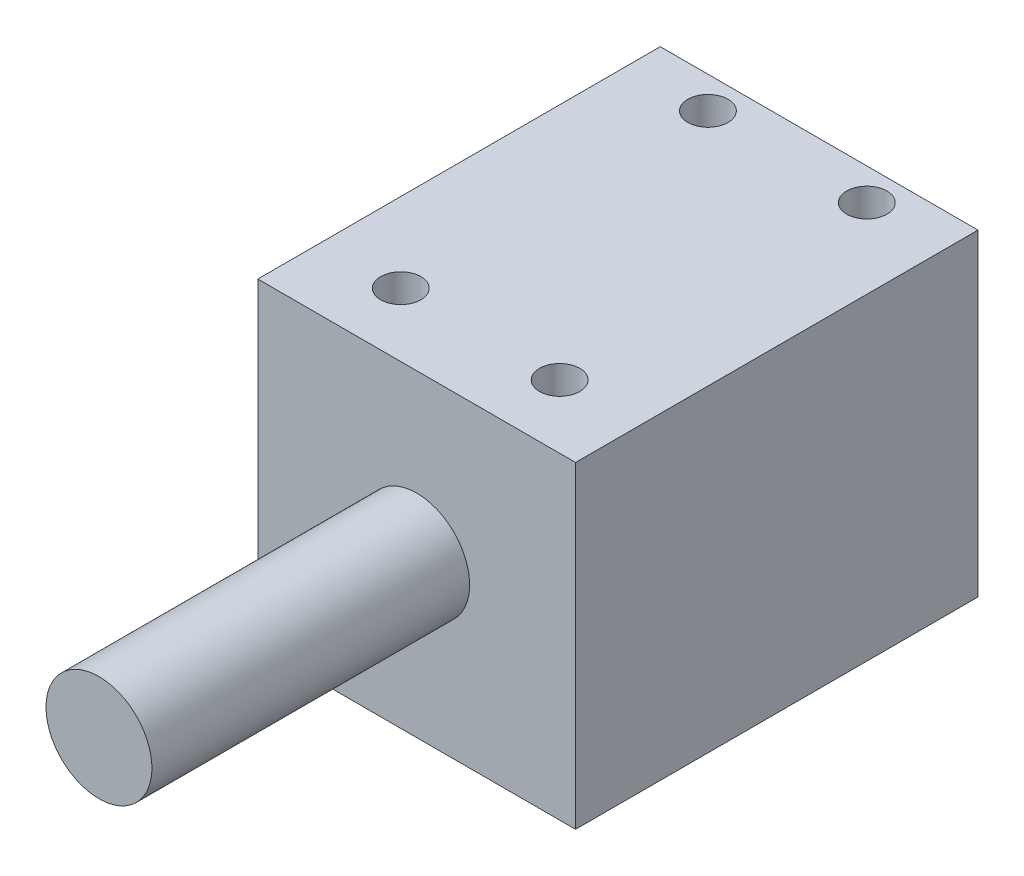
ISO-10303-21;
HEADER;
FILE_DESCRIPTION(('STEP AP214'),'2;1');
FILE_NAME('part.step','',(''),(''),'','','');
FILE_SCHEMA(('AUTOMOTIVE_DESIGN { 1 0 10303 214 1 1 1 1 }'));
ENDSEC;
DATA;
#1=APPLICATION_CONTEXT('core data for automotive mechanical design processes');
#2=APPLICATION_PROTOCOL_DEFINITION('international standard','automotive_design',2000,#1);
#3=PRODUCT_CONTEXT('',#1,'mechanical');
#4=PRODUCT('Part','Part','',(#3));
#5=PRODUCT_RELATED_PRODUCT_CATEGORY('part','',(#4));
#6=PRODUCT_DEFINITION_FORMATION('','',#4);
#7=PRODUCT_DEFINITION_CONTEXT('part definition',#1,'design');
#8=PRODUCT_DEFINITION('design','',#6,#7);
#9=PRODUCT_DEFINITION_SHAPE('','',#8);
#10=(LENGTH_UNIT() NAMED_UNIT(*) SI_UNIT(.MILLI.,.METRE.));
#11=(NAMED_UNIT(*) PLANE_ANGLE_UNIT() SI_UNIT($,.RADIAN.));
#12=(NAMED_UNIT(*) SI_UNIT($,.STERADIAN.) SOLID_ANGLE_UNIT());
#13=UNCERTAINTY_MEASURE_WITH_UNIT(LENGTH_MEASURE(1.E-05),#10,'distance_accuracy_value','');
#14=(GEOMETRIC_REPRESENTATION_CONTEXT(3) GLOBAL_UNCERTAINTY_ASSIGNED_CONTEXT((#13)) GLOBAL_UNIT_ASSIGNED_CONTEXT((#10,
#11,#12)) REPRESENTATION_CONTEXT('',''));
#15=CARTESIAN_POINT('',(0.,0.,0.));
#16=DIRECTION('',(0.,0.,1.));
#17=DIRECTION('',(1.,0.,0.));
#18=AXIS2_PLACEMENT_3D('',#15,#16,#17);
#19=CARTESIAN_POINT('',(-19.05,-19.05,-48.26));
#20=DIRECTION('',(1.,0.,0.));
#21=DIRECTION('',(0.,0.,-1.));
#22=AXIS2_PLACEMENT_3D('',#19,#20,#21);
#23=PLANE('',#22);
#24=DIRECTION('',(0.,1.,0.));
#25=VECTOR('',#24,1.);
#26=CARTESIAN_POINT('',(-19.05,-19.05,0.));
#27=LINE('',#26,#25);
#28=CARTESIAN_POINT('',(-19.05,-19.05,0.));
#29=VERTEX_POINT('',#28);
#30=CARTESIAN_POINT('',(-19.05,19.05,0.));
#31=VERTEX_POINT('',#30);
#32=EDGE_CURVE('E99',#29,#31,#27,.T.);
#33=ORIENTED_EDGE('',*,*,#32,.T.);
#34=DIRECTION('',(0.,0.,1.));
#35=VECTOR('',#34,1.);
#36=CARTESIAN_POINT('',(-19.05,19.05,-48.26));
#37=LINE('',#36,#35);
#38=CARTESIAN_POINT('',(-19.05,19.05,-48.26));
#39=VERTEX_POINT('',#38);
#40=EDGE_CURVE('E41',#39,#31,#37,.T.);
#41=ORIENTED_EDGE('',*,*,#40,.F.);
#42=DIRECTION('',(0.,1.,0.));
#43=VECTOR('',#42,1.);
#44=CARTESIAN_POINT('',(-19.05,-19.05,-48.26));
#45=LINE('',#44,#43);
#46=CARTESIAN_POINT('',(-19.05,-19.05,-48.26));
#47=VERTEX_POINT('',#46);
#48=EDGE_CURVE('E83',#47,#39,#45,.T.);
#49=ORIENTED_EDGE('',*,*,#48,.F.);
#50=DIRECTION('',(0.,0.,1.));
#51=VECTOR('',#50,1.);
#52=CARTESIAN_POINT('',(-19.05,-19.05,-48.26));
#53=LINE('',#52,#51);
#54=EDGE_CURVE('E49',#47,#29,#53,.T.);
#55=ORIENTED_EDGE('',*,*,#54,.T.);
#56=EDGE_LOOP('',(#33,#41,#49,#55));
#57=FACE_BOUND('',#56,.T.);
#58=ADVANCED_FACE('F33',(#57),#23,.F.);
#59=CARTESIAN_POINT('',(-19.05,19.05,-48.26));
#60=DIRECTION('',(0.,-1.,0.));
#61=DIRECTION('',(0.,0.,-1.));
#62=AXIS2_PLACEMENT_3D('',#59,#60,#61);
#63=PLANE('',#62);
#64=CARTESIAN_POINT('',(-9.525,19.05,-7.62));
#65=DIRECTION('',(0.,1.,0.));
#66=DIRECTION('',(0.,0.,1.));
#67=AXIS2_PLACEMENT_3D('',#64,#65,#66);
#68=CIRCLE('',#67,2.413);
#69=CARTESIAN_POINT('',(-9.525,19.05,-5.207));
#70=VERTEX_POINT('',#69);
#71=EDGE_CURVE('E133',#70,#70,#68,.T.);
#72=ORIENTED_EDGE('',*,*,#71,.F.);
#73=EDGE_LOOP('',(#72));
#74=FACE_BOUND('',#73,.T.);
#75=CARTESIAN_POINT('',(9.525,19.05,-7.62));
#76=DIRECTION('',(0.,1.,0.));
#77=DIRECTION('',(0.,0.,1.));
#78=AXIS2_PLACEMENT_3D('',#75,#76,#77);
#79=CIRCLE('',#78,2.413);
#80=CARTESIAN_POINT('',(9.525,19.05,-5.207));
#81=VERTEX_POINT('',#80);
#82=EDGE_CURVE('E137',#81,#81,#79,.T.);
#83=ORIENTED_EDGE('',*,*,#82,.F.);
#84=EDGE_LOOP('',(#83));
#85=FACE_BOUND('',#84,.T.);
#86=CARTESIAN_POINT('',(9.525,19.05,-44.45));
#87=DIRECTION('',(0.,1.,0.));
#88=DIRECTION('',(0.,0.,1.));
#89=AXIS2_PLACEMENT_3D('',#86,#87,#88);
#90=CIRCLE('',#89,2.413);
#91=CARTESIAN_POINT('',(9.525,19.05,-42.037));
#92=VERTEX_POINT('',#91);
#93=EDGE_CURVE('E141',#92,#92,#90,.T.);
#94=ORIENTED_EDGE('',*,*,#93,.F.);
#95=EDGE_LOOP('',(#94));
#96=FACE_BOUND('',#95,.T.);
#97=CARTESIAN_POINT('',(-9.525,19.05,-44.45));
#98=DIRECTION('',(0.,1.,0.));
#99=DIRECTION('',(0.,0.,1.));
#100=AXIS2_PLACEMENT_3D('',#97,#98,#99);
#101=CIRCLE('',#100,2.413);
#102=CARTESIAN_POINT('',(-9.525,19.05,-42.037));
#103=VERTEX_POINT('',#102);
#104=EDGE_CURVE('E144',#103,#103,#101,.T.);
#105=ORIENTED_EDGE('',*,*,#104,.F.);
#106=EDGE_LOOP('',(#105));
#107=FACE_BOUND('',#106,.T.);
#108=DIRECTION('',(1.,0.,0.));
#109=VECTOR('',#108,1.);
#110=CARTESIAN_POINT('',(-19.05,19.05,0.));
#111=LINE('',#110,#109);
#112=CARTESIAN_POINT('',(19.05,19.05,0.));
#113=VERTEX_POINT('',#112);
#114=EDGE_CURVE('E89',#31,#113,#111,.T.);
#115=ORIENTED_EDGE('',*,*,#114,.T.);
#116=DIRECTION('',(0.,0.,1.));
#117=VECTOR('',#116,1.);
#118=CARTESIAN_POINT('',(19.05,19.05,-48.26));
#119=LINE('',#118,#117);
#120=CARTESIAN_POINT('',(19.05,19.05,-48.26));
#121=VERTEX_POINT('',#120);
#122=EDGE_CURVE('E87',#121,#113,#119,.T.);
#123=ORIENTED_EDGE('',*,*,#122,.F.);
#124=DIRECTION('',(1.,0.,0.));
#125=VECTOR('',#124,1.);
#126=CARTESIAN_POINT('',(-19.05,19.05,-48.26));
#127=LINE('',#126,#125);
#128=EDGE_CURVE('E75',#39,#121,#127,.T.);
#129=ORIENTED_EDGE('',*,*,#128,.F.);
#130=ORIENTED_EDGE('',*,*,#40,.T.);
#131=EDGE_LOOP('',(#115,#123,#129,#130));
#132=FACE_BOUND('',#131,.T.);
#133=ADVANCED_FACE('F88',(#74,#85,#96,#107,#132),#63,.F.);
#134=CARTESIAN_POINT('',(19.05,-19.05,-48.26));
#135=DIRECTION('',(1.,0.,0.));
#136=DIRECTION('',(0.,0.,-1.));
#137=AXIS2_PLACEMENT_3D('',#134,#135,#136);
#138=PLANE('',#137);
#139=DIRECTION('',(0.,1.,0.));
#140=VECTOR('',#139,1.);
#141=CARTESIAN_POINT('',(19.05,-19.05,0.));
#142=LINE('',#141,#140);
#143=CARTESIAN_POINT('',(19.05,-19.05,0.));
#144=VERTEX_POINT('',#143);
#145=EDGE_CURVE('E103',#144,#113,#142,.T.);
#146=ORIENTED_EDGE('',*,*,#145,.F.);
#147=DIRECTION('',(0.,0.,1.));
#148=VECTOR('',#147,1.);
#149=CARTESIAN_POINT('',(19.05,-19.05,-48.26));
#150=LINE('',#149,#148);
#151=CARTESIAN_POINT('',(19.05,-19.05,-48.26));
#152=VERTEX_POINT('',#151);
#153=EDGE_CURVE('E63',#152,#144,#150,.T.);
#154=ORIENTED_EDGE('',*,*,#153,.F.);
#155=DIRECTION('',(0.,1.,0.));
#156=VECTOR('',#155,1.);
#157=CARTESIAN_POINT('',(19.05,-19.05,-48.26));
#158=LINE('',#157,#156);
#159=EDGE_CURVE('E82',#152,#121,#158,.T.);
#160=ORIENTED_EDGE('',*,*,#159,.T.);
#161=ORIENTED_EDGE('',*,*,#122,.T.);
#162=EDGE_LOOP('',(#146,#154,#160,#161));
#163=FACE_BOUND('',#162,.T.);
#164=ADVANCED_FACE('F93',(#163),#138,.T.);
#165=CARTESIAN_POINT('',(-19.05,-19.05,-48.26));
#166=DIRECTION('',(0.,-1.,0.));
#167=DIRECTION('',(0.,0.,-1.));
#168=AXIS2_PLACEMENT_3D('',#165,#166,#167);
#169=PLANE('',#168);
#170=DIRECTION('',(1.,0.,0.));
#171=VECTOR('',#170,1.);
#172=CARTESIAN_POINT('',(-19.05,-19.05,0.));
#173=LINE('',#172,#171);
#174=EDGE_CURVE('E105',#29,#144,#173,.T.);
#175=ORIENTED_EDGE('',*,*,#174,.F.);
#176=ORIENTED_EDGE('',*,*,#54,.F.);
#177=DIRECTION('',(1.,0.,0.));
#178=VECTOR('',#177,1.);
#179=CARTESIAN_POINT('',(-19.05,-19.05,-48.26));
#180=LINE('',#179,#178);
#181=EDGE_CURVE('E94',#47,#152,#180,.T.);
#182=ORIENTED_EDGE('',*,*,#181,.T.);
#183=ORIENTED_EDGE('',*,*,#153,.T.);
#184=EDGE_LOOP('',(#175,#176,#182,#183));
#185=FACE_BOUND('',#184,.T.);
#186=ADVANCED_FACE('F111',(#185),#169,.T.);
#187=CARTESIAN_POINT('',(0.,0.,-48.26));
#188=DIRECTION('',(0.,0.,-1.));
#189=DIRECTION('',(-1.,0.,0.));
#190=AXIS2_PLACEMENT_3D('',#187,#188,#189);
#191=PLANE('',#190);
#192=ORIENTED_EDGE('',*,*,#48,.T.);
#193=ORIENTED_EDGE('',*,*,#128,.T.);
#194=ORIENTED_EDGE('',*,*,#159,.F.);
#195=ORIENTED_EDGE('',*,*,#181,.F.);
#196=EDGE_LOOP('',(#192,#193,#194,#195));
#197=FACE_BOUND('',#196,.T.);
#198=ADVANCED_FACE('F79',(#197),#191,.T.);
#199=CARTESIAN_POINT('',(0.,0.,0.));
#200=DIRECTION('',(0.,0.,-1.));
#201=DIRECTION('',(-1.,0.,0.));
#202=AXIS2_PLACEMENT_3D('',#199,#200,#201);
#203=PLANE('',#202);
#204=CARTESIAN_POINT('',(0.,0.,0.));
#205=DIRECTION('',(0.,0.,-1.));
#206=DIRECTION('',(-1.,0.,0.));
#207=AXIS2_PLACEMENT_3D('',#204,#205,#206);
#208=CIRCLE('',#207,6.35);
#209=CARTESIAN_POINT('',(-6.35,0.,0.));
#210=VERTEX_POINT('',#209);
#211=EDGE_CURVE('E11',#210,#210,#208,.F.);
#212=ORIENTED_EDGE('',*,*,#211,.F.);
#213=EDGE_LOOP('',(#212));
#214=FACE_BOUND('',#213,.T.);
#215=ORIENTED_EDGE('',*,*,#32,.F.);
#216=ORIENTED_EDGE('',*,*,#174,.T.);
#217=ORIENTED_EDGE('',*,*,#145,.T.);
#218=ORIENTED_EDGE('',*,*,#114,.F.);
#219=EDGE_LOOP('',(#215,#216,#217,#218));
#220=FACE_BOUND('',#219,.T.);
#221=ADVANCED_FACE('F110',(#214,#220),#203,.F.);
#222=CARTESIAN_POINT('',(0.,0.,38.1));
#223=DIRECTION('',(0.,0.,-1.));
#224=DIRECTION('',(-1.,0.,0.));
#225=AXIS2_PLACEMENT_3D('',#222,#223,#224);
#226=CYLINDRICAL_SURFACE('',#225,6.35);
#227=CARTESIAN_POINT('',(0.,0.,38.1));
#228=DIRECTION('',(0.,0.,1.));
#229=DIRECTION('',(1.,0.,0.));
#230=AXIS2_PLACEMENT_3D('',#227,#228,#229);
#231=CIRCLE('',#230,6.35);
#232=CARTESIAN_POINT('',(-6.35,0.,38.1));
#233=VERTEX_POINT('',#232);
#234=EDGE_CURVE('E101',#233,#233,#231,.T.);
#235=CARTESIAN_POINT('',(-6.35,0.,38.1));
#236=CARTESIAN_POINT('',(-6.35,0.,37.703125));
#237=CARTESIAN_POINT('',(-6.35,0.,37.30625));
#238=CARTESIAN_POINT('',(-6.35,0.,36.5125));
#239=CARTESIAN_POINT('',(-6.35,0.,36.115625));
#240=CARTESIAN_POINT('',(-6.35,0.,35.321875));
#241=CARTESIAN_POINT('',(-6.35,0.,34.925));
#242=CARTESIAN_POINT('',(-6.35,0.,34.13125));
#243=CARTESIAN_POINT('',(-6.35,0.,33.734375));
#244=CARTESIAN_POINT('',(-6.35,0.,32.940625));
#245=CARTESIAN_POINT('',(-6.35,0.,32.54375));
#246=CARTESIAN_POINT('',(-6.35,0.,31.75));
#247=CARTESIAN_POINT('',(-6.35,0.,31.353125));
#248=CARTESIAN_POINT('',(-6.35,0.,30.559375));
#249=CARTESIAN_POINT('',(-6.35,0.,30.1625));
#250=CARTESIAN_POINT('',(-6.35,0.,29.36875));
#251=CARTESIAN_POINT('',(-6.35,0.,28.971875));
#252=CARTESIAN_POINT('',(-6.35,0.,28.178125));
#253=CARTESIAN_POINT('',(-6.35,0.,27.78125));
#254=CARTESIAN_POINT('',(-6.35,0.,26.9875));
#255=CARTESIAN_POINT('',(-6.35,0.,26.590625));
#256=CARTESIAN_POINT('',(-6.35,0.,25.796875));
#257=CARTESIAN_POINT('',(-6.35,0.,25.4));
#258=CARTESIAN_POINT('',(-6.35,0.,24.60625));
#259=CARTESIAN_POINT('',(-6.35,0.,24.209375));
#260=CARTESIAN_POINT('',(-6.35,0.,23.415625));
#261=CARTESIAN_POINT('',(-6.35,0.,23.01875));
#262=CARTESIAN_POINT('',(-6.35,0.,22.225));
#263=CARTESIAN_POINT('',(-6.35,0.,21.828125));
#264=CARTESIAN_POINT('',(-6.35,0.,21.034375));
#265=CARTESIAN_POINT('',(-6.35,0.,20.6375));
#266=CARTESIAN_POINT('',(-6.35,0.,19.84375));
#267=CARTESIAN_POINT('',(-6.35,0.,19.446875));
#268=CARTESIAN_POINT('',(-6.35,0.,18.653125));
#269=CARTESIAN_POINT('',(-6.35,0.,18.25625));
#270=CARTESIAN_POINT('',(-6.35,0.,17.4625));
#271=CARTESIAN_POINT('',(-6.35,0.,17.065625));
#272=CARTESIAN_POINT('',(-6.35,0.,16.271875));
#273=CARTESIAN_POINT('',(-6.35,0.,15.875));
#274=CARTESIAN_POINT('',(-6.35,0.,15.08125));
#275=CARTESIAN_POINT('',(-6.35,0.,14.684375));
#276=CARTESIAN_POINT('',(-6.35,0.,13.890625));
#277=CARTESIAN_POINT('',(-6.35,0.,13.49375));
#278=CARTESIAN_POINT('',(-6.35,0.,12.7));
#279=CARTESIAN_POINT('',(-6.35,0.,12.303125));
#280=CARTESIAN_POINT('',(-6.35,0.,11.509375));
#281=CARTESIAN_POINT('',(-6.35,0.,11.1125));
#282=CARTESIAN_POINT('',(-6.35,0.,10.31875));
#283=CARTESIAN_POINT('',(-6.35,0.,9.921875));
#284=CARTESIAN_POINT('',(-6.35,0.,9.128125));
#285=CARTESIAN_POINT('',(-6.35,0.,8.73125));
#286=CARTESIAN_POINT('',(-6.35,0.,7.9375));
#287=CARTESIAN_POINT('',(-6.35,0.,7.540625));
#288=CARTESIAN_POINT('',(-6.35,0.,6.746875));
#289=CARTESIAN_POINT('',(-6.35,0.,6.35));
#290=CARTESIAN_POINT('',(-6.35,0.,5.55625));
#291=CARTESIAN_POINT('',(-6.35,0.,5.159375));
#292=CARTESIAN_POINT('',(-6.35,0.,4.365625));
#293=CARTESIAN_POINT('',(-6.35,0.,3.96875));
#294=CARTESIAN_POINT('',(-6.35,0.,3.175));
#295=CARTESIAN_POINT('',(-6.35,0.,2.778125));
#296=CARTESIAN_POINT('',(-6.35,0.,1.984375));
#297=CARTESIAN_POINT('',(-6.35,0.,1.5875));
#298=CARTESIAN_POINT('',(-6.35,0.,0.79375));
#299=CARTESIAN_POINT('',(-6.35,0.,0.396875));
#300=CARTESIAN_POINT('',(-6.35,0.,0.));
#301=B_SPLINE_CURVE_WITH_KNOTS('',3,(#235,#236,#237,#238,#239,#240,#241,#242,#243,#244,#245,
#246,#247,#248,#249,#250,#251,#252,#253,#254,#255,#256,#257,#258,#259,#260,#261,#262,#263,#264,
#265,#266,#267,#268,#269,#270,#271,#272,#273,#274,#275,#276,#277,#278,#279,#280,#281,#282,#283,
#284,#285,#286,#287,#288,#289,#290,#291,#292,#293,#294,#295,#296,#297,#298,#299,#300),
.UNSPECIFIED.,.F.,.F.,(4,2,2,2,2,2,2,2,2,2,2,2,2,2,2,2,2,2,2,2,2,2,2,2,2,2,2,2,2,2,2,2,4),(0.,
1.19062499999999,2.38124999999999,3.571875,4.7625,5.953125,7.14375,8.33437499999999,9.525,
10.715625,11.90625,13.096875,14.2875,15.478125,16.66875,17.859375,19.05,20.240625,21.43125,
22.621875,23.8125,25.003125,26.19375,27.384375,28.575,29.765625,30.95625,32.146875,33.3375,
34.528125,35.71875,36.909375,38.1),.UNSPECIFIED.);
#302=EDGE_CURVE('BSEAM160',#233,#210,#301,.T.);
#303=ORIENTED_EDGE('',*,*,#234,.F.);
#304=ORIENTED_EDGE('',*,*,#211,.T.);
#305=ORIENTED_EDGE('',*,*,#302,.T.);
#306=ORIENTED_EDGE('',*,*,#302,.F.);
#307=EDGE_LOOP('',(#303,#305,#304,#306));
#308=FACE_BOUND('',#307,.T.);
#309=ADVANCED_FACE('F160',(#308),#226,.T.);
#310=CARTESIAN_POINT('',(0.,0.,38.1));
#311=DIRECTION('',(0.,0.,1.));
#312=DIRECTION('',(1.,0.,0.));
#313=AXIS2_PLACEMENT_3D('',#310,#311,#312);
#314=PLANE('',#313);
#315=ORIENTED_EDGE('',*,*,#234,.T.);
#316=EDGE_LOOP('',(#315));
#317=FACE_BOUND('',#316,.T.);
#318=ADVANCED_FACE('F158',(#317),#314,.T.);
#319=CARTESIAN_POINT('',(-9.525,8.89,-44.45));
#320=DIRECTION('',(0.,1.,0.));
#321=DIRECTION('',(0.,0.,1.));
#322=AXIS2_PLACEMENT_3D('',#319,#320,#321);
#323=CYLINDRICAL_SURFACE('',#322,2.413);
#324=CARTESIAN_POINT('',(-9.525,8.89,-44.45));
#325=DIRECTION('',(0.,1.,0.));
#326=DIRECTION('',(0.,0.,1.));
#327=AXIS2_PLACEMENT_3D('',#324,#325,#326);
#328=CIRCLE('',#327,2.413);
#329=CARTESIAN_POINT('',(-9.525,8.89,-42.037));
#330=VERTEX_POINT('',#329);
#331=EDGE_CURVE('E146',#330,#330,#328,.T.);
#332=ORIENTED_EDGE('',*,*,#331,.F.);
#333=EDGE_LOOP('',(#332));
#334=FACE_BOUND('',#333,.T.);
#335=ORIENTED_EDGE('',*,*,#104,.T.);
#336=EDGE_LOOP('',(#335));
#337=FACE_BOUND('',#336,.T.);
#338=ADVANCED_FACE('F172',(#334,#337),#323,.F.);
#339=CARTESIAN_POINT('',(-9.525,8.89,-44.45));
#340=DIRECTION('',(0.,1.,0.));
#341=DIRECTION('',(0.,0.,1.));
#342=AXIS2_PLACEMENT_3D('',#339,#340,#341);
#343=PLANE('',#342);
#344=ORIENTED_EDGE('',*,*,#331,.T.);
#345=EDGE_LOOP('',(#344));
#346=FACE_BOUND('',#345,.T.);
#347=ADVANCED_FACE('F175',(#346),#343,.T.);
#348=CARTESIAN_POINT('',(9.525,8.89,-44.45));
#349=DIRECTION('',(0.,1.,0.));
#350=DIRECTION('',(0.,0.,1.));
#351=AXIS2_PLACEMENT_3D('',#348,#349,#350);
#352=CYLINDRICAL_SURFACE('',#351,2.413);
#353=CARTESIAN_POINT('',(9.525,8.89,-44.45));
#354=DIRECTION('',(0.,1.,0.));
#355=DIRECTION('',(0.,0.,1.));
#356=AXIS2_PLACEMENT_3D('',#353,#354,#355);
#357=CIRCLE('',#356,2.413);
#358=CARTESIAN_POINT('',(9.525,8.89,-42.037));
#359=VERTEX_POINT('',#358);
#360=EDGE_CURVE('E147',#359,#359,#357,.T.);
#361=ORIENTED_EDGE('',*,*,#360,.F.);
#362=EDGE_LOOP('',(#361));
#363=FACE_BOUND('',#362,.T.);
#364=ORIENTED_EDGE('',*,*,#93,.T.);
#365=EDGE_LOOP('',(#364));
#366=FACE_BOUND('',#365,.T.);
#367=ADVANCED_FACE('F179',(#363,#366),#352,.F.);
#368=CARTESIAN_POINT('',(9.525,8.89,-44.45));
#369=DIRECTION('',(0.,1.,0.));
#370=DIRECTION('',(0.,0.,1.));
#371=AXIS2_PLACEMENT_3D('',#368,#369,#370);
#372=PLANE('',#371);
#373=ORIENTED_EDGE('',*,*,#360,.T.);
#374=EDGE_LOOP('',(#373));
#375=FACE_BOUND('',#374,.T.);
#376=ADVANCED_FACE('F183',(#375),#372,.T.);
#377=CARTESIAN_POINT('',(9.525,8.89,-7.62));
#378=DIRECTION('',(0.,1.,0.));
#379=DIRECTION('',(0.,0.,1.));
#380=AXIS2_PLACEMENT_3D('',#377,#378,#379);
#381=CYLINDRICAL_SURFACE('',#380,2.413);
#382=CARTESIAN_POINT('',(9.525,8.89,-7.62));
#383=DIRECTION('',(0.,1.,0.));
#384=DIRECTION('',(0.,0.,1.));
#385=AXIS2_PLACEMENT_3D('',#382,#383,#384);
#386=CIRCLE('',#385,2.413);
#387=CARTESIAN_POINT('',(9.525,8.89,-5.207));
#388=VERTEX_POINT('',#387);
#389=EDGE_CURVE('E209',#388,#388,#386,.T.);
#390=ORIENTED_EDGE('',*,*,#389,.F.);
#391=EDGE_LOOP('',(#390));
#392=FACE_BOUND('',#391,.T.);
#393=ORIENTED_EDGE('',*,*,#82,.T.);
#394=EDGE_LOOP('',(#393));
#395=FACE_BOUND('',#394,.T.);
#396=ADVANCED_FACE('F187',(#392,#395),#381,.F.);
#397=CARTESIAN_POINT('',(9.525,8.89,-7.62));
#398=DIRECTION('',(0.,1.,0.));
#399=DIRECTION('',(0.,0.,1.));
#400=AXIS2_PLACEMENT_3D('',#397,#398,#399);
#401=PLANE('',#400);
#402=ORIENTED_EDGE('',*,*,#389,.T.);
#403=EDGE_LOOP('',(#402));
#404=FACE_BOUND('',#403,.T.);
#405=ADVANCED_FACE('F191',(#404),#401,.T.);
#406=CARTESIAN_POINT('',(-9.525,8.89,-7.62));
#407=DIRECTION('',(0.,1.,0.));
#408=DIRECTION('',(0.,0.,1.));
#409=AXIS2_PLACEMENT_3D('',#406,#407,#408);
#410=CYLINDRICAL_SURFACE('',#409,2.413);
#411=CARTESIAN_POINT('',(-9.525,8.89,-7.62));
#412=DIRECTION('',(0.,1.,0.));
#413=DIRECTION('',(0.,0.,1.));
#414=AXIS2_PLACEMENT_3D('',#411,#412,#413);
#415=CIRCLE('',#414,2.413);
#416=CARTESIAN_POINT('',(-9.525,8.89,-5.207));
#417=VERTEX_POINT('',#416);
#418=EDGE_CURVE('E207',#417,#417,#415,.T.);
#419=ORIENTED_EDGE('',*,*,#418,.F.);
#420=EDGE_LOOP('',(#419));
#421=FACE_BOUND('',#420,.T.);
#422=ORIENTED_EDGE('',*,*,#71,.T.);
#423=EDGE_LOOP('',(#422));
#424=FACE_BOUND('',#423,.T.);
#425=ADVANCED_FACE('F195',(#421,#424),#410,.F.);
#426=CARTESIAN_POINT('',(-9.525,8.89,-7.62));
#427=DIRECTION('',(0.,1.,0.));
#428=DIRECTION('',(0.,0.,1.));
#429=AXIS2_PLACEMENT_3D('',#426,#427,#428);
#430=PLANE('',#429);
#431=ORIENTED_EDGE('',*,*,#418,.T.);
#432=EDGE_LOOP('',(#431));
#433=FACE_BOUND('',#432,.T.);
#434=ADVANCED_FACE('F199',(#433),#430,.T.);
#435=CLOSED_SHELL('',(#58,#133,#164,#186,#198,#221,#309,#318,#338,#347,#367,#376,#396,#405,#425,#434));
#436=MANIFOLD_SOLID_BREP('B2',#435);
#437=ADVANCED_BREP_SHAPE_REPRESENTATION('',(#18,#436),#14);
#438=SHAPE_DEFINITION_REPRESENTATION(#9,#437);
ENDSEC;
END-ISO-10303-21;
